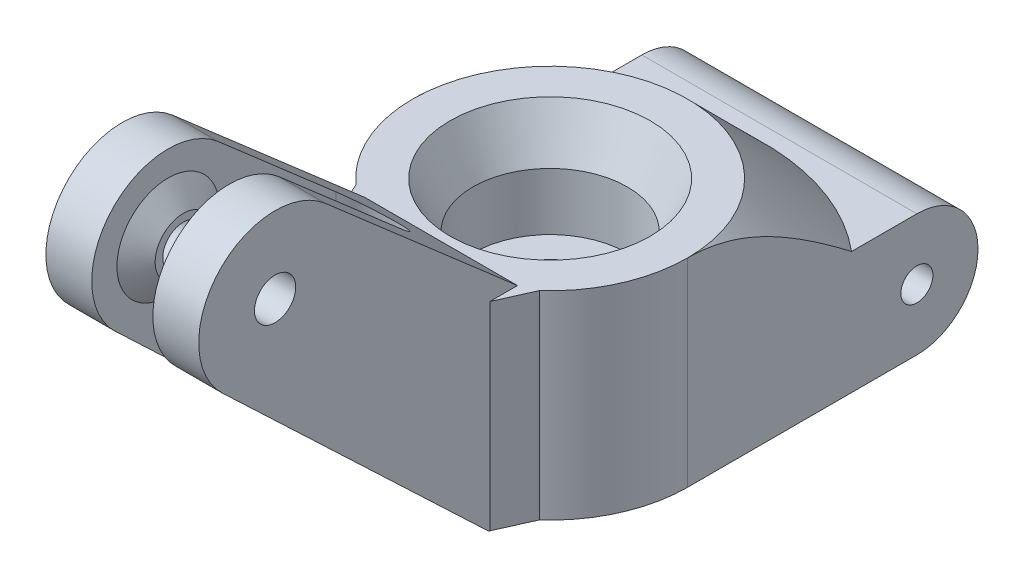
ISO-10303-21;
HEADER;
FILE_DESCRIPTION(('STEP AP214'),'2;1');
FILE_NAME('part.step','',(''),(''),'','','');
FILE_SCHEMA(('AUTOMOTIVE_DESIGN { 1 0 10303 214 1 1 1 1 }'));
ENDSEC;
DATA;
#1=APPLICATION_CONTEXT('core data for automotive mechanical design processes');
#2=APPLICATION_PROTOCOL_DEFINITION('international standard','automotive_design',2000,#1);
#3=PRODUCT_CONTEXT('',#1,'mechanical');
#4=PRODUCT('Part','Part','',(#3));
#5=PRODUCT_RELATED_PRODUCT_CATEGORY('part','',(#4));
#6=PRODUCT_DEFINITION_FORMATION('','',#4);
#7=PRODUCT_DEFINITION_CONTEXT('part definition',#1,'design');
#8=PRODUCT_DEFINITION('design','',#6,#7);
#9=PRODUCT_DEFINITION_SHAPE('','',#8);
#10=(LENGTH_UNIT() NAMED_UNIT(*) SI_UNIT(.MILLI.,.METRE.));
#11=(NAMED_UNIT(*) PLANE_ANGLE_UNIT() SI_UNIT($,.RADIAN.));
#12=(NAMED_UNIT(*) SI_UNIT($,.STERADIAN.) SOLID_ANGLE_UNIT());
#13=UNCERTAINTY_MEASURE_WITH_UNIT(LENGTH_MEASURE(1.E-05),#10,'distance_accuracy_value','');
#14=(GEOMETRIC_REPRESENTATION_CONTEXT(3) GLOBAL_UNCERTAINTY_ASSIGNED_CONTEXT((#13)) GLOBAL_UNIT_ASSIGNED_CONTEXT((#10,
#11,#12)) REPRESENTATION_CONTEXT('',''));
#15=CARTESIAN_POINT('',(0.,0.,0.));
#16=DIRECTION('',(0.,0.,1.));
#17=DIRECTION('',(1.,0.,0.));
#18=AXIS2_PLACEMENT_3D('',#15,#16,#17);
#19=CARTESIAN_POINT('',(1.,13.6784962974169,24.6));
#20=DIRECTION('',(1.,0.,0.));
#21=DIRECTION('',(0.,0.,-1.));
#22=AXIS2_PLACEMENT_3D('',#19,#20,#21);
#23=PLANE('',#22);
#24=CARTESIAN_POINT('',(1.,13.6784962974169,23.));
#25=DIRECTION('',(-1.,0.,0.));
#26=DIRECTION('',(0.,0.,1.));
#27=AXIS2_PLACEMENT_3D('',#24,#25,#26);
#28=CIRCLE('',#27,1.35);
#29=CARTESIAN_POINT('',(1.,13.6784962974169,24.35));
#30=VERTEX_POINT('',#29);
#31=EDGE_CURVE('E451',#30,#30,#28,.F.);
#32=ORIENTED_EDGE('',*,*,#31,.T.);
#33=EDGE_LOOP('',(#32));
#34=FACE_BOUND('',#33,.T.);
#35=CARTESIAN_POINT('',(0.999999999976353,13.6784962974169,23.));
#36=DIRECTION('',(1.,0.,0.));
#37=DIRECTION('',(0.,0.,-1.));
#38=AXIS2_PLACEMENT_3D('',#35,#36,#37);
#39=CIRCLE('',#38,1.85000000002265);
#40=CARTESIAN_POINT('',(0.999999999976353,13.6784962974169,21.1499999999774));
#41=VERTEX_POINT('',#40);
#42=EDGE_CURVE('E445',#41,#41,#39,.T.);
#43=ORIENTED_EDGE('',*,*,#42,.F.);
#44=EDGE_LOOP('',(#43));
#45=FACE_BOUND('',#44,.T.);
#46=ADVANCED_FACE('F34',(#34,#45),#23,.F.);
#47=CARTESIAN_POINT('',(-1.,13.6784962974169,24.6));
#48=DIRECTION('',(-1.,0.,0.));
#49=DIRECTION('',(0.,0.,1.));
#50=AXIS2_PLACEMENT_3D('',#47,#48,#49);
#51=PLANE('',#50);
#52=CARTESIAN_POINT('',(-1.00000000001425,13.6784962974169,23.));
#53=DIRECTION('',(-1.,0.,0.));
#54=DIRECTION('',(0.,0.,1.));
#55=AXIS2_PLACEMENT_3D('',#52,#53,#54);
#56=CIRCLE('',#55,1.85000000001492);
#57=CARTESIAN_POINT('',(-1.00000000001425,13.6784962974169,24.8500000000149));
#58=VERTEX_POINT('',#57);
#59=EDGE_CURVE('E448',#58,#58,#56,.T.);
#60=ORIENTED_EDGE('',*,*,#59,.F.);
#61=EDGE_LOOP('',(#60));
#62=FACE_BOUND('',#61,.T.);
#63=CARTESIAN_POINT('',(-1.,13.6784962974169,23.));
#64=DIRECTION('',(-1.,0.,0.));
#65=DIRECTION('',(0.,0.,1.));
#66=AXIS2_PLACEMENT_3D('',#63,#64,#65);
#67=CIRCLE('',#66,1.35);
#68=CARTESIAN_POINT('',(-1.,13.6784962974169,24.35));
#69=VERTEX_POINT('',#68);
#70=EDGE_CURVE('E205',#69,#69,#67,.T.);
#71=ORIENTED_EDGE('',*,*,#70,.T.);
#72=EDGE_LOOP('',(#71));
#73=FACE_BOUND('',#72,.T.);
#74=ADVANCED_FACE('F519',(#62,#73),#51,.F.);
#75=CARTESIAN_POINT('',(0.,6.5,0.));
#76=DIRECTION('',(0.,-1.,0.));
#77=DIRECTION('',(0.,0.,-1.));
#78=AXIS2_PLACEMENT_3D('',#75,#76,#77);
#79=CYLINDRICAL_SURFACE('',#78,5.05);
#80=CARTESIAN_POINT('',(0.,-0.25,0.));
#81=DIRECTION('',(0.,-1.,0.));
#82=DIRECTION('',(0.,0.,-1.));
#83=AXIS2_PLACEMENT_3D('',#80,#81,#82);
#84=CIRCLE('',#83,5.05);
#85=CARTESIAN_POINT('',(0.,-0.25,-5.05));
#86=VERTEX_POINT('',#85);
#87=EDGE_CURVE('E453',#86,#86,#84,.T.);
#88=ORIENTED_EDGE('',*,*,#87,.T.);
#89=EDGE_LOOP('',(#88));
#90=FACE_BOUND('',#89,.T.);
#91=CARTESIAN_POINT('',(0.,3.49999999997408,0.));
#92=DIRECTION('',(0.,1.,0.));
#93=DIRECTION('',(0.,0.,1.));
#94=AXIS2_PLACEMENT_3D('',#91,#92,#93);
#95=CIRCLE('',#94,5.0499999999829);
#96=CARTESIAN_POINT('',(0.,3.49999999997408,5.0499999999829));
#97=VERTEX_POINT('',#96);
#98=EDGE_CURVE('E183',#97,#97,#95,.T.);
#99=ORIENTED_EDGE('',*,*,#98,.T.);
#100=EDGE_LOOP('',(#99));
#101=FACE_BOUND('',#100,.T.);
#102=ADVANCED_FACE('F516',(#90,#101),#79,.F.);
#103=CARTESIAN_POINT('',(0.,-0.25,0.));
#104=DIRECTION('',(0.,-1.,0.));
#105=DIRECTION('',(0.,0.,-1.));
#106=AXIS2_PLACEMENT_3D('',#103,#104,#105);
#107=PLANE('',#106);
#108=CARTESIAN_POINT('',(0.,-0.25,0.));
#109=DIRECTION('',(0.,1.,0.));
#110=DIRECTION('',(0.,0.,1.));
#111=AXIS2_PLACEMENT_3D('',#108,#109,#110);
#112=CIRCLE('',#111,3.05);
#113=CARTESIAN_POINT('',(0.,-0.25,3.05));
#114=VERTEX_POINT('',#113);
#115=EDGE_CURVE('E458',#114,#114,#112,.T.);
#116=ORIENTED_EDGE('',*,*,#115,.F.);
#117=EDGE_LOOP('',(#116));
#118=FACE_BOUND('',#117,.T.);
#119=ORIENTED_EDGE('',*,*,#87,.F.);
#120=EDGE_LOOP('',(#119));
#121=FACE_BOUND('',#120,.T.);
#122=ADVANCED_FACE('F512',(#118,#121),#107,.F.);
#123=CARTESIAN_POINT('',(47.2923235334351,13.6784962974169,23.));
#124=DIRECTION('',(-1.,0.,0.));
#125=DIRECTION('',(0.,0.,1.));
#126=AXIS2_PLACEMENT_3D('',#123,#124,#125);
#127=CYLINDRICAL_SURFACE('',#126,1.35);
#128=ORIENTED_EDGE('',*,*,#31,.F.);
#129=EDGE_LOOP('',(#128));
#130=FACE_BOUND('',#129,.T.);
#131=CARTESIAN_POINT('',(5.,13.6784962974169,23.));
#132=DIRECTION('',(-1.,0.,0.));
#133=DIRECTION('',(0.,0.,1.));
#134=AXIS2_PLACEMENT_3D('',#131,#132,#133);
#135=CIRCLE('',#134,1.35);
#136=CARTESIAN_POINT('',(5.,13.6784962974169,24.35));
#137=VERTEX_POINT('',#136);
#138=EDGE_CURVE('E135',#137,#137,#135,.T.);
#139=ORIENTED_EDGE('',*,*,#138,.F.);
#140=EDGE_LOOP('',(#139));
#141=FACE_BOUND('',#140,.T.);
#142=ADVANCED_FACE('F505',(#130,#141),#127,.F.);
#143=CARTESIAN_POINT('',(-1.99999999989586,13.6784962974169,23.));
#144=DIRECTION('',(-1.,0.,0.));
#145=DIRECTION('',(0.,0.,1.));
#146=AXIS2_PLACEMENT_3D('',#143,#144,#145);
#147=CONICAL_SURFACE('',#146,3.34999999986576,0.982793723256074);
#148=CARTESIAN_POINT('',(-1.99999999997165,13.6784962974169,23.));
#149=DIRECTION('',(-1.,0.,0.));
#150=DIRECTION('',(0.,0.,1.));
#151=AXIS2_PLACEMENT_3D('',#148,#149,#150);
#152=CIRCLE('',#151,3.34999999997945);
#153=CARTESIAN_POINT('',(-1.99999999997165,13.6784962974169,26.3499999999794));
#154=VERTEX_POINT('',#153);
#155=EDGE_CURVE('E146',#154,#154,#152,.T.);
#156=ORIENTED_EDGE('',*,*,#155,.F.);
#157=EDGE_LOOP('',(#156));
#158=FACE_BOUND('',#157,.T.);
#159=ORIENTED_EDGE('',*,*,#59,.T.);
#160=EDGE_LOOP('',(#159));
#161=FACE_BOUND('',#160,.T.);
#162=ADVANCED_FACE('F495',(#158,#161),#147,.T.);
#163=CARTESIAN_POINT('',(1.99999999995271,13.6784962974169,23.));
#164=DIRECTION('',(1.,0.,0.));
#165=DIRECTION('',(0.,0.,-1.));
#166=AXIS2_PLACEMENT_3D('',#163,#164,#165);
#167=CONICAL_SURFACE('',#166,3.35000000004402,0.982793723264819);
#168=ORIENTED_EDGE('',*,*,#42,.T.);
#169=EDGE_LOOP('',(#168));
#170=FACE_BOUND('',#169,.T.);
#171=CARTESIAN_POINT('',(1.99999999995271,13.6784962974169,23.));
#172=DIRECTION('',(1.,0.,0.));
#173=DIRECTION('',(0.,0.,-1.));
#174=AXIS2_PLACEMENT_3D('',#171,#172,#173);
#175=CIRCLE('',#174,3.35000000004402);
#176=CARTESIAN_POINT('',(1.99999999995271,13.6784962974169,19.649999999956));
#177=VERTEX_POINT('',#176);
#178=EDGE_CURVE('E372',#177,#177,#175,.F.);
#179=ORIENTED_EDGE('',*,*,#178,.T.);
#180=EDGE_LOOP('',(#179));
#181=FACE_BOUND('',#180,.T.);
#182=ADVANCED_FACE('F492',(#170,#181),#167,.T.);
#183=CARTESIAN_POINT('',(47.2923235334351,13.6784962974169,23.));
#184=DIRECTION('',(-1.,0.,0.));
#185=DIRECTION('',(0.,0.,1.));
#186=AXIS2_PLACEMENT_3D('',#183,#184,#185);
#187=CYLINDRICAL_SURFACE('',#186,1.35);
#188=ORIENTED_EDGE('',*,*,#70,.F.);
#189=EDGE_LOOP('',(#188));
#190=FACE_BOUND('',#189,.T.);
#191=CARTESIAN_POINT('',(-5.,13.6784962974169,23.));
#192=DIRECTION('',(-1.,0.,0.));
#193=DIRECTION('',(0.,0.,1.));
#194=AXIS2_PLACEMENT_3D('',#191,#192,#193);
#195=CIRCLE('',#194,1.35);
#196=CARTESIAN_POINT('',(-5.,13.6784962974169,24.35));
#197=VERTEX_POINT('',#196);
#198=EDGE_CURVE('E366',#197,#197,#195,.T.);
#199=ORIENTED_EDGE('',*,*,#198,.T.);
#200=EDGE_LOOP('',(#199));
#201=FACE_BOUND('',#200,.T.);
#202=ADVANCED_FACE('F494',(#190,#201),#187,.F.);
#203=CARTESIAN_POINT('',(0.,6.49999999995998,0.));
#204=DIRECTION('',(0.,1.,0.));
#205=DIRECTION('',(0.,0.,1.));
#206=AXIS2_PLACEMENT_3D('',#203,#204,#205);
#207=CONICAL_SURFACE('',#206,6.54999999997585,0.463647609000806);
#208=CARTESIAN_POINT('',(0.,6.49999999995998,0.));
#209=DIRECTION('',(0.,1.,0.));
#210=DIRECTION('',(0.,0.,1.));
#211=AXIS2_PLACEMENT_3D('',#208,#209,#210);
#212=CIRCLE('',#211,6.54999999997585);
#213=CARTESIAN_POINT('',(0.,6.49999999995998,6.54999999997585));
#214=VERTEX_POINT('',#213);
#215=EDGE_CURVE('E355',#214,#214,#212,.T.);
#216=ORIENTED_EDGE('',*,*,#215,.T.);
#217=EDGE_LOOP('',(#216));
#218=FACE_BOUND('',#217,.T.);
#219=ORIENTED_EDGE('',*,*,#98,.F.);
#220=EDGE_LOOP('',(#219));
#221=FACE_BOUND('',#220,.T.);
#222=ADVANCED_FACE('F502',(#218,#221),#207,.F.);
#223=CARTESIAN_POINT('',(5.,11.9750607436954,13.4266058700264));
#224=DIRECTION('',(0.,-0.754325037994784,0.656501132561223));
#225=DIRECTION('',(0.,-0.656501132561223,-0.754325037994784));
#226=AXIS2_PLACEMENT_3D('',#223,#224,#225);
#227=PLANE('',#226);
#228=DIRECTION('',(0.,0.656501132561219,0.754325037994787));
#229=VECTOR('',#228,1.);
#230=CARTESIAN_POINT('',(-2.,10.7334628618586,12.));
#231=LINE('',#230,#229);
#232=CARTESIAN_POINT('',(-2.,10.7334628618586,12.));
#233=VERTEX_POINT('',#232);
#234=CARTESIAN_POINT('',(-2.,17.4501214873908,19.7174943371939));
#235=VERTEX_POINT('',#234);
#236=EDGE_CURVE('E128',#233,#235,#231,.T.);
#237=ORIENTED_EDGE('',*,*,#236,.F.);
#238=CARTESIAN_POINT('',(0.,10.7334628618586,12.));
#239=DIRECTION('',(0.,-0.754325037994784,0.656501132561223));
#240=DIRECTION('',(0.,0.656501132561223,0.754325037994784));
#241=AXIS2_PLACEMENT_3D('',#238,#239,#240);
#242=ELLIPSE('',#241,2.65137692541213,2.);
#243=CARTESIAN_POINT('',(2.,10.7334628618586,12.));
#244=VERTEX_POINT('',#243);
#245=EDGE_CURVE('E437',#233,#244,#242,.T.);
#246=ORIENTED_EDGE('',*,*,#245,.T.);
#247=DIRECTION('',(0.,0.656501132561219,0.754325037994787));
#248=VECTOR('',#247,1.);
#249=CARTESIAN_POINT('',(2.,10.7334628618586,12.));
#250=LINE('',#249,#248);
#251=CARTESIAN_POINT('',(2.,17.4501214873908,19.7174943371939));
#252=VERTEX_POINT('',#251);
#253=EDGE_CURVE('E211',#244,#252,#250,.T.);
#254=ORIENTED_EDGE('',*,*,#253,.T.);
#255=DIRECTION('',(-1.,0.,0.));
#256=VECTOR('',#255,1.);
#257=CARTESIAN_POINT('',(5.,17.4501214873908,19.7174943371939));
#258=LINE('',#257,#256);
#259=CARTESIAN_POINT('',(5.,17.4501214873908,19.7174943371939));
#260=VERTEX_POINT('',#259);
#261=EDGE_CURVE('E208',#260,#252,#258,.T.);
#262=ORIENTED_EDGE('',*,*,#261,.F.);
#263=DIRECTION('',(0.,0.656501132561222,0.754325037994784));
#264=VECTOR('',#263,1.);
#265=CARTESIAN_POINT('',(5.,6.5,7.13571740285894));
#266=LINE('',#265,#264);
#267=CARTESIAN_POINT('',(5.,6.5,7.13571740285894));
#268=VERTEX_POINT('',#267);
#269=EDGE_CURVE('E170',#268,#260,#266,.T.);
#270=ORIENTED_EDGE('',*,*,#269,.F.);
#271=DIRECTION('',(1.,0.,0.));
#272=VECTOR('',#271,1.);
#273=CARTESIAN_POINT('',(0.,6.5,7.13571740285894));
#274=LINE('',#273,#272);
#275=CARTESIAN_POINT('',(-5.,6.5,7.13571740285894));
#276=VERTEX_POINT('',#275);
#277=EDGE_CURVE('E195',#268,#276,#274,.F.);
#278=ORIENTED_EDGE('',*,*,#277,.T.);
#279=DIRECTION('',(0.,0.656501132561222,0.754325037994784));
#280=VECTOR('',#279,1.);
#281=CARTESIAN_POINT('',(-5.,6.5,7.13571740285894));
#282=LINE('',#281,#280);
#283=CARTESIAN_POINT('',(-5.,17.4501214873908,19.7174943371939));
#284=VERTEX_POINT('',#283);
#285=EDGE_CURVE('E132',#276,#284,#282,.T.);
#286=ORIENTED_EDGE('',*,*,#285,.T.);
#287=DIRECTION('',(-1.,0.,0.));
#288=VECTOR('',#287,1.);
#289=CARTESIAN_POINT('',(5.,17.4501214873908,19.7174943371939));
#290=LINE('',#289,#288);
#291=EDGE_CURVE('E124',#235,#284,#290,.T.);
#292=ORIENTED_EDGE('',*,*,#291,.F.);
#293=EDGE_LOOP('',(#237,#246,#254,#262,#270,#278,#286,#292));
#294=FACE_BOUND('',#293,.T.);
#295=ADVANCED_FACE('F126',(#294),#227,.F.);
#296=CARTESIAN_POINT('',(5.,13.6784962974169,23.));
#297=DIRECTION('',(1.,0.,0.));
#298=DIRECTION('',(0.,0.,-1.));
#299=AXIS2_PLACEMENT_3D('',#296,#297,#298);
#300=PLANE('',#299);
#301=ORIENTED_EDGE('',*,*,#138,.T.);
#302=EDGE_LOOP('',(#301));
#303=FACE_BOUND('',#302,.T.);
#304=CARTESIAN_POINT('',(5.,13.6784962974169,23.));
#305=DIRECTION('',(-1.,0.,0.));
#306=DIRECTION('',(0.,0.,1.));
#307=AXIS2_PLACEMENT_3D('',#304,#305,#306);
#308=CIRCLE('',#307,5.);
#309=CARTESIAN_POINT('',(5.,10.0516244423554,26.4417728784688));
#310=VERTEX_POINT('',#309);
#311=EDGE_CURVE('E360',#310,#260,#308,.T.);
#312=ORIENTED_EDGE('',*,*,#311,.F.);
#313=DIRECTION('',(0.,0.688354575693754,0.725374371012288));
#314=VECTOR('',#313,1.);
#315=CARTESIAN_POINT('',(5.,1.77581222117773,17.7208864392344));
#316=LINE('',#315,#314);
#317=CARTESIAN_POINT('',(5.,-6.5,9.));
#318=VERTEX_POINT('',#317);
#319=EDGE_CURVE('E160',#310,#318,#316,.F.);
#320=ORIENTED_EDGE('',*,*,#319,.T.);
#321=DIRECTION('',(0.,0.,-1.));
#322=VECTOR('',#321,1.);
#323=CARTESIAN_POINT('',(5.,-6.5,23.));
#324=LINE('',#323,#322);
#325=CARTESIAN_POINT('',(5.,-6.5,8.94427190999927));
#326=VERTEX_POINT('',#325);
#327=EDGE_CURVE('E173',#318,#326,#324,.T.);
#328=ORIENTED_EDGE('',*,*,#327,.T.);
#329=DIRECTION('',(0.,1.,0.));
#330=VECTOR('',#329,1.);
#331=CARTESIAN_POINT('',(5.,6.5,8.94427190999927));
#332=LINE('',#331,#330);
#333=CARTESIAN_POINT('',(5.,6.5,8.94427190999927));
#334=VERTEX_POINT('',#333);
#335=EDGE_CURVE('E178',#334,#326,#332,.F.);
#336=ORIENTED_EDGE('',*,*,#335,.F.);
#337=DIRECTION('',(0.,0.,-1.));
#338=VECTOR('',#337,1.);
#339=CARTESIAN_POINT('',(5.,6.5,0.));
#340=LINE('',#339,#338);
#341=EDGE_CURVE('E192',#334,#268,#340,.T.);
#342=ORIENTED_EDGE('',*,*,#341,.T.);
#343=ORIENTED_EDGE('',*,*,#269,.T.);
#344=EDGE_LOOP('',(#312,#320,#328,#336,#342,#343));
#345=FACE_BOUND('',#344,.T.);
#346=ADVANCED_FACE('F386',(#303,#345),#300,.T.);
#347=CARTESIAN_POINT('',(5.,13.6784962974169,23.));
#348=DIRECTION('',(-1.,0.,0.));
#349=DIRECTION('',(0.,0.,1.));
#350=AXIS2_PLACEMENT_3D('',#347,#348,#349);
#351=CYLINDRICAL_SURFACE('',#350,5.);
#352=CARTESIAN_POINT('',(-5.,13.6784962974169,23.));
#353=DIRECTION('',(-1.,0.,0.));
#354=DIRECTION('',(0.,0.,1.));
#355=AXIS2_PLACEMENT_3D('',#352,#353,#354);
#356=CIRCLE('',#355,5.);
#357=CARTESIAN_POINT('',(-5.,10.0516244423554,26.4417728784688));
#358=VERTEX_POINT('',#357);
#359=EDGE_CURVE('E359',#284,#358,#356,.F.);
#360=ORIENTED_EDGE('',*,*,#359,.T.);
#361=DIRECTION('',(1.,0.,0.));
#362=VECTOR('',#361,1.);
#363=CARTESIAN_POINT('',(5.,10.0516244423554,26.4417728784688));
#364=LINE('',#363,#362);
#365=CARTESIAN_POINT('',(-2.,10.0516244423554,26.4417728784688));
#366=VERTEX_POINT('',#365);
#367=EDGE_CURVE('E142',#358,#366,#364,.T.);
#368=ORIENTED_EDGE('',*,*,#367,.T.);
#369=CARTESIAN_POINT('',(-2.,13.6784962974169,23.));
#370=DIRECTION('',(-1.,0.,0.));
#371=DIRECTION('',(0.,0.,1.));
#372=AXIS2_PLACEMENT_3D('',#369,#370,#371);
#373=CIRCLE('',#372,5.);
#374=EDGE_CURVE('E139',#235,#366,#373,.F.);
#375=ORIENTED_EDGE('',*,*,#374,.F.);
#376=ORIENTED_EDGE('',*,*,#291,.T.);
#377=EDGE_LOOP('',(#360,#368,#375,#376));
#378=FACE_BOUND('',#377,.T.);
#379=ADVANCED_FACE('F140',(#378),#351,.T.);
#380=CARTESIAN_POINT('',(-2.,0.,0.));
#381=DIRECTION('',(1.,0.,0.));
#382=DIRECTION('',(0.,0.,-1.));
#383=AXIS2_PLACEMENT_3D('',#380,#381,#382);
#384=PLANE('',#383);
#385=ORIENTED_EDGE('',*,*,#155,.T.);
#386=EDGE_LOOP('',(#385));
#387=FACE_BOUND('',#386,.T.);
#388=ORIENTED_EDGE('',*,*,#236,.T.);
#389=ORIENTED_EDGE('',*,*,#374,.T.);
#390=DIRECTION('',(0.,0.688354575693754,0.725374371012288));
#391=VECTOR('',#390,1.);
#392=CARTESIAN_POINT('',(-2.,1.77581222117773,17.7208864392344));
#393=LINE('',#392,#391);
#394=CARTESIAN_POINT('',(-2.,-3.65310629985537,12.));
#395=VERTEX_POINT('',#394);
#396=EDGE_CURVE('E156',#366,#395,#393,.F.);
#397=ORIENTED_EDGE('',*,*,#396,.T.);
#398=DIRECTION('',(0.,-1.,0.));
#399=VECTOR('',#398,1.);
#400=CARTESIAN_POINT('',(-2.,0.,12.));
#401=LINE('',#400,#399);
#402=EDGE_CURVE('E150',#395,#233,#401,.F.);
#403=ORIENTED_EDGE('',*,*,#402,.T.);
#404=EDGE_LOOP('',(#388,#389,#397,#403));
#405=FACE_BOUND('',#404,.T.);
#406=ADVANCED_FACE('F148',(#387,#405),#384,.T.);
#407=CARTESIAN_POINT('',(0.,4.99387508232712,12.));
#408=DIRECTION('',(0.,1.,0.));
#409=DIRECTION('',(0.,0.,1.));
#410=AXIS2_PLACEMENT_3D('',#407,#408,#409);
#411=CYLINDRICAL_SURFACE('',#410,2.);
#412=DIRECTION('',(0.,1.,0.));
#413=VECTOR('',#412,1.);
#414=CARTESIAN_POINT('',(2.,0.,12.));
#415=LINE('',#414,#413);
#416=CARTESIAN_POINT('',(2.,-3.65310629985537,12.));
#417=VERTEX_POINT('',#416);
#418=EDGE_CURVE('E370',#417,#244,#415,.T.);
#419=ORIENTED_EDGE('',*,*,#418,.T.);
#420=ORIENTED_EDGE('',*,*,#245,.F.);
#421=ORIENTED_EDGE('',*,*,#402,.F.);
#422=CARTESIAN_POINT('',(0.,-3.65310629985537,12.));
#423=DIRECTION('',(0.,0.725374371012288,-0.688354575693754));
#424=DIRECTION('',(0.,0.688354575693754,0.725374371012288));
#425=AXIS2_PLACEMENT_3D('',#422,#423,#424);
#426=ELLIPSE('',#425,2.75719694536343,2.);
#427=EDGE_CURVE('E339',#395,#417,#426,.F.);
#428=ORIENTED_EDGE('',*,*,#427,.T.);
#429=EDGE_LOOP('',(#419,#420,#421,#428));
#430=FACE_BOUND('',#429,.T.);
#431=ADVANCED_FACE('F482',(#430),#411,.F.);
#432=CARTESIAN_POINT('',(2.,0.,0.));
#433=DIRECTION('',(1.,0.,0.));
#434=DIRECTION('',(0.,0.,-1.));
#435=AXIS2_PLACEMENT_3D('',#432,#433,#434);
#436=PLANE('',#435);
#437=ORIENTED_EDGE('',*,*,#418,.F.);
#438=DIRECTION('',(0.,0.688354575693754,0.725374371012288));
#439=VECTOR('',#438,1.);
#440=CARTESIAN_POINT('',(2.,1.77581222117773,17.7208864392344));
#441=LINE('',#440,#439);
#442=CARTESIAN_POINT('',(2.,10.0516244423554,26.4417728784688));
#443=VERTEX_POINT('',#442);
#444=EDGE_CURVE('E337',#417,#443,#441,.T.);
#445=ORIENTED_EDGE('',*,*,#444,.T.);
#446=CARTESIAN_POINT('',(2.,13.6784962974169,23.));
#447=DIRECTION('',(-1.,0.,0.));
#448=DIRECTION('',(0.,0.,1.));
#449=AXIS2_PLACEMENT_3D('',#446,#447,#448);
#450=CIRCLE('',#449,5.);
#451=EDGE_CURVE('E210',#252,#443,#450,.F.);
#452=ORIENTED_EDGE('',*,*,#451,.F.);
#453=ORIENTED_EDGE('',*,*,#253,.F.);
#454=EDGE_LOOP('',(#437,#445,#452,#453));
#455=FACE_BOUND('',#454,.T.);
#456=ORIENTED_EDGE('',*,*,#178,.F.);
#457=EDGE_LOOP('',(#456));
#458=FACE_BOUND('',#457,.T.);
#459=ADVANCED_FACE('F486',(#455,#458),#436,.F.);
#460=CARTESIAN_POINT('',(5.,13.6784962974169,23.));
#461=DIRECTION('',(-1.,0.,0.));
#462=DIRECTION('',(0.,0.,1.));
#463=AXIS2_PLACEMENT_3D('',#460,#461,#462);
#464=CYLINDRICAL_SURFACE('',#463,5.);
#465=DIRECTION('',(1.,0.,0.));
#466=VECTOR('',#465,1.);
#467=CARTESIAN_POINT('',(5.,10.0516244423554,26.4417728784688));
#468=LINE('',#467,#466);
#469=EDGE_CURVE('E334',#443,#310,#468,.T.);
#470=ORIENTED_EDGE('',*,*,#469,.T.);
#471=ORIENTED_EDGE('',*,*,#311,.T.);
#472=ORIENTED_EDGE('',*,*,#261,.T.);
#473=ORIENTED_EDGE('',*,*,#451,.T.);
#474=EDGE_LOOP('',(#470,#471,#472,#473));
#475=FACE_BOUND('',#474,.T.);
#476=ADVANCED_FACE('F379',(#475),#464,.T.);
#477=CARTESIAN_POINT('',(-5.,13.6784962974169,23.));
#478=DIRECTION('',(1.,0.,0.));
#479=DIRECTION('',(0.,0.,-1.));
#480=AXIS2_PLACEMENT_3D('',#477,#478,#479);
#481=PLANE('',#480);
#482=ORIENTED_EDGE('',*,*,#198,.F.);
#483=EDGE_LOOP('',(#482));
#484=FACE_BOUND('',#483,.T.);
#485=DIRECTION('',(0.,1.,0.));
#486=VECTOR('',#485,1.);
#487=CARTESIAN_POINT('',(-4.99999999999999,6.5,8.94427190999926));
#488=LINE('',#487,#486);
#489=CARTESIAN_POINT('',(-5.,-6.5,8.94427190999927));
#490=VERTEX_POINT('',#489);
#491=CARTESIAN_POINT('',(-4.99999999999999,6.5,8.94427190999926));
#492=VERTEX_POINT('',#491);
#493=EDGE_CURVE('E331',#490,#492,#488,.T.);
#494=ORIENTED_EDGE('',*,*,#493,.F.);
#495=DIRECTION('',(0.,0.,-1.));
#496=VECTOR('',#495,1.);
#497=CARTESIAN_POINT('',(-5.,-6.5,23.));
#498=LINE('',#497,#496);
#499=CARTESIAN_POINT('',(-5.,-6.5,9.));
#500=VERTEX_POINT('',#499);
#501=EDGE_CURVE('E363',#500,#490,#498,.T.);
#502=ORIENTED_EDGE('',*,*,#501,.F.);
#503=DIRECTION('',(0.,0.688354575693754,0.725374371012288));
#504=VECTOR('',#503,1.);
#505=CARTESIAN_POINT('',(-5.,1.77581222117773,17.7208864392344));
#506=LINE('',#505,#504);
#507=EDGE_CURVE('E157',#500,#358,#506,.T.);
#508=ORIENTED_EDGE('',*,*,#507,.T.);
#509=ORIENTED_EDGE('',*,*,#359,.F.);
#510=ORIENTED_EDGE('',*,*,#285,.F.);
#511=DIRECTION('',(0.,0.,-1.));
#512=VECTOR('',#511,1.);
#513=CARTESIAN_POINT('',(-5.,6.5,0.));
#514=LINE('',#513,#512);
#515=EDGE_CURVE('E196',#276,#492,#514,.F.);
#516=ORIENTED_EDGE('',*,*,#515,.T.);
#517=EDGE_LOOP('',(#494,#502,#508,#509,#510,#516));
#518=FACE_BOUND('',#517,.T.);
#519=ADVANCED_FACE('F480',(#484,#518),#481,.F.);
#520=CARTESIAN_POINT('',(0.,6.5,0.));
#521=DIRECTION('',(0.,-1.,0.));
#522=DIRECTION('',(0.,0.,-1.));
#523=AXIS2_PLACEMENT_3D('',#520,#521,#522);
#524=PLANE('',#523);
#525=ORIENTED_EDGE('',*,*,#341,.F.);
#526=DIRECTION('',(0.408248290463849,0.,-0.912870929175283));
#527=VECTOR('',#526,1.);
#528=CARTESIAN_POINT('',(5.,6.5,8.94427190999927));
#529=LINE('',#528,#527);
#530=CARTESIAN_POINT('',(6.00000000000001,6.5,6.70820393249936));
#531=VERTEX_POINT('',#530);
#532=EDGE_CURVE('E186',#531,#334,#529,.F.);
#533=ORIENTED_EDGE('',*,*,#532,.F.);
#534=CARTESIAN_POINT('',(0.,6.5,0.));
#535=DIRECTION('',(0.,-1.,0.));
#536=DIRECTION('',(0.,0.,-1.));
#537=AXIS2_PLACEMENT_3D('',#534,#535,#536);
#538=CIRCLE('',#537,9.);
#539=CARTESIAN_POINT('',(9.,6.5,0.));
#540=VERTEX_POINT('',#539);
#541=EDGE_CURVE('E343',#540,#531,#538,.T.);
#542=ORIENTED_EDGE('',*,*,#541,.F.);
#543=CARTESIAN_POINT('',(0.,6.5,0.));
#544=DIRECTION('',(0.,-1.,0.));
#545=DIRECTION('',(0.,0.,-1.));
#546=AXIS2_PLACEMENT_3D('',#543,#544,#545);
#547=CIRCLE('',#546,9.);
#548=CARTESIAN_POINT('',(-9.,6.5,0.));
#549=VERTEX_POINT('',#548);
#550=EDGE_CURVE('E418',#549,#540,#547,.T.);
#551=ORIENTED_EDGE('',*,*,#550,.F.);
#552=CARTESIAN_POINT('',(0.,6.5,0.));
#553=DIRECTION('',(0.,-1.,0.));
#554=DIRECTION('',(0.,0.,-1.));
#555=AXIS2_PLACEMENT_3D('',#552,#553,#554);
#556=CIRCLE('',#555,9.);
#557=CARTESIAN_POINT('',(-6.,6.5,6.70820393249937));
#558=VERTEX_POINT('',#557);
#559=EDGE_CURVE('E329',#558,#549,#556,.T.);
#560=ORIENTED_EDGE('',*,*,#559,.F.);
#561=DIRECTION('',(0.408248290463849,0.,0.912870929175283));
#562=VECTOR('',#561,1.);
#563=CARTESIAN_POINT('',(-6.,6.5,6.70820393249936));
#564=LINE('',#563,#562);
#565=EDGE_CURVE('E330',#492,#558,#564,.F.);
#566=ORIENTED_EDGE('',*,*,#565,.F.);
#567=ORIENTED_EDGE('',*,*,#515,.F.);
#568=ORIENTED_EDGE('',*,*,#277,.F.);
#569=EDGE_LOOP('',(#525,#533,#542,#551,#560,#566,#567,#568));
#570=FACE_BOUND('',#569,.T.);
#571=ORIENTED_EDGE('',*,*,#215,.F.);
#572=EDGE_LOOP('',(#571));
#573=FACE_BOUND('',#572,.T.);
#574=ADVANCED_FACE('F476',(#570,#573),#524,.F.);
#575=CARTESIAN_POINT('',(-500000.,-2.5,-15.));
#576=DIRECTION('',(1.,0.,0.));
#577=DIRECTION('',(0.,0.,-1.));
#578=AXIS2_PLACEMENT_3D('',#575,#576,#577);
#579=CYLINDRICAL_SURFACE('',#578,1.05);
#580=CARTESIAN_POINT('',(9.00000000001455,-2.5,-15.));
#581=DIRECTION('',(1.,0.,0.));
#582=DIRECTION('',(0.,0.,-1.));
#583=AXIS2_PLACEMENT_3D('',#580,#581,#582);
#584=CIRCLE('',#583,1.05);
#585=CARTESIAN_POINT('',(9.00000000001455,-2.5,-16.05));
#586=VERTEX_POINT('',#585);
#587=EDGE_CURVE('E235',#586,#586,#584,.F.);
#588=ORIENTED_EDGE('',*,*,#587,.F.);
#589=EDGE_LOOP('',(#588));
#590=FACE_BOUND('',#589,.T.);
#591=CARTESIAN_POINT('',(-9.00000000001455,-2.5,-15.));
#592=DIRECTION('',(1.,0.,0.));
#593=DIRECTION('',(0.,0.,-1.));
#594=AXIS2_PLACEMENT_3D('',#591,#592,#593);
#595=CIRCLE('',#594,1.05);
#596=CARTESIAN_POINT('',(-9.00000000001455,-2.5,-16.05));
#597=VERTEX_POINT('',#596);
#598=EDGE_CURVE('E262',#597,#597,#595,.F.);
#599=ORIENTED_EDGE('',*,*,#598,.T.);
#600=EDGE_LOOP('',(#599));
#601=FACE_BOUND('',#600,.T.);
#602=ADVANCED_FACE('F538',(#590,#601),#579,.F.);
#603=CARTESIAN_POINT('',(9.,1.5,-7.5));
#604=DIRECTION('',(0.,-1.,0.));
#605=DIRECTION('',(0.,0.,-1.));
#606=AXIS2_PLACEMENT_3D('',#603,#604,#605);
#607=PLANE('',#606);
#608=CARTESIAN_POINT('',(0.,1.5,0.));
#609=DIRECTION('',(0.,-1.,0.));
#610=DIRECTION('',(0.,0.,-1.));
#611=AXIS2_PLACEMENT_3D('',#608,#609,#610);
#612=CIRCLE('',#611,14.);
#613=CARTESIAN_POINT('',(9.,1.5,-10.7238052947636));
#614=VERTEX_POINT('',#613);
#615=CARTESIAN_POINT('',(-9.,1.5,-10.7238052947636));
#616=VERTEX_POINT('',#615);
#617=EDGE_CURVE('E200',#614,#616,#612,.F.);
#618=ORIENTED_EDGE('',*,*,#617,.F.);
#619=DIRECTION('',(0.,0.,-1.));
#620=VECTOR('',#619,1.);
#621=CARTESIAN_POINT('',(9.,1.5,-15.));
#622=LINE('',#621,#620);
#623=CARTESIAN_POINT('',(9.,1.5,-15.));
#624=VERTEX_POINT('',#623);
#625=EDGE_CURVE('E234',#624,#614,#622,.F.);
#626=ORIENTED_EDGE('',*,*,#625,.F.);
#627=DIRECTION('',(-1.,0.,0.));
#628=VECTOR('',#627,1.);
#629=CARTESIAN_POINT('',(9.,1.5,-15.));
#630=LINE('',#629,#628);
#631=CARTESIAN_POINT('',(-9.,1.5,-15.));
#632=VERTEX_POINT('',#631);
#633=EDGE_CURVE('E348',#632,#624,#630,.F.);
#634=ORIENTED_EDGE('',*,*,#633,.F.);
#635=DIRECTION('',(0.,0.,-1.));
#636=VECTOR('',#635,1.);
#637=CARTESIAN_POINT('',(-9.,1.5,-15.));
#638=LINE('',#637,#636);
#639=EDGE_CURVE('E321',#632,#616,#638,.F.);
#640=ORIENTED_EDGE('',*,*,#639,.T.);
#641=EDGE_LOOP('',(#618,#626,#634,#640));
#642=FACE_BOUND('',#641,.T.);
#643=ADVANCED_FACE('F247',(#642),#607,.F.);
#644=CARTESIAN_POINT('',(0.,1.5,0.));
#645=DIRECTION('',(0.,-1.,0.));
#646=DIRECTION('',(0.,0.,-1.));
#647=AXIS2_PLACEMENT_3D('',#644,#645,#646);
#648=CONICAL_SURFACE('',#647,14.,0.785398163397448);
#649=CARTESIAN_POINT('',(-9.,1.5,-10.7238052947636));
#650=CARTESIAN_POINT('',(-9.,1.71316971976153,-10.4454319030313));
#651=CARTESIAN_POINT('',(-9.,1.92426520978799,-10.1654392557351));
#652=CARTESIAN_POINT('',(-9.,2.34127756010684,-9.60148270552378));
#653=CARTESIAN_POINT('',(-9.,2.54719265272238,-9.31751749715698));
#654=CARTESIAN_POINT('',(-9.,2.95441077203168,-8.74261066759795));
#655=CARTESIAN_POINT('',(-9.,3.15565897683418,-8.45163006965748));
#656=CARTESIAN_POINT('',(-9.,3.5501157266273,-7.86429413869675));
#657=CARTESIAN_POINT('',(-9.,3.74332514641737,-7.5679393955698));
#658=CARTESIAN_POINT('',(-9.,4.11135109358233,-6.98218497770914));
#659=CARTESIAN_POINT('',(-9.,4.28660335226297,-6.69306028605395));
#660=CARTESIAN_POINT('',(-9.,4.6256453886614,-6.10806293387794));
#661=CARTESIAN_POINT('',(-9.,4.7894333543612,-5.81218921637752));
#662=CARTESIAN_POINT('',(-9.,5.10202209347351,-5.21371907613065));
#663=CARTESIAN_POINT('',(-9.,5.2508670613525,-4.9111459143701));
#664=CARTESIAN_POINT('',(-9.,5.53024835185193,-4.29772448259318));
#665=CARTESIAN_POINT('',(-9.,5.66079292303338,-3.98688001637156));
#666=CARTESIAN_POINT('',(-9.,5.88955998343776,-3.38124758885551));
#667=CARTESIAN_POINT('',(-9.,5.9895174629741,-3.0871206829836));
#668=CARTESIAN_POINT('',(-9.,6.16571970157694,-2.49186547436849));
#669=CARTESIAN_POINT('',(-9.,6.24197794747373,-2.19074125893336));
#670=CARTESIAN_POINT('',(-9.,6.33612678260047,-1.73193647056293));
#671=CARTESIAN_POINT('',(-9.,6.3643016061968,-1.5763268751873));
#672=CARTESIAN_POINT('',(-9.,6.41299448881295,-1.26390860989743));
#673=CARTESIAN_POINT('',(-9.,6.4335129891943,-1.1071000096338));
#674=CARTESIAN_POINT('',(-9.,6.46656537374254,-0.792153340710454));
#675=CARTESIAN_POINT('',(-9.,6.4790745376764,-0.634012667852245));
#676=CARTESIAN_POINT('',(-9.,6.49580678074533,-0.31725152237369));
#677=CARTESIAN_POINT('',(-9.,6.50002757966074,-0.158630929739364));
#678=CARTESIAN_POINT('',(-9.,6.5,0.));
#679=B_SPLINE_CURVE_WITH_KNOTS('',3,(#649,#650,#651,#652,#653,#654,#655,#656,#657,#658,#659,
#660,#661,#662,#663,#664,#665,#666,#667,#668,#669,#670,#671,#672,#673,#674,#675,#676,#677,#678),
.UNSPECIFIED.,.F.,.F.,(4,2,2,2,2,2,2,2,2,2,2,2,2,2,4),(0.,1.05188117302124,2.10411653439653,
3.1653919094779,4.22655149039431,5.24061936841527,6.25484716726072,7.26598105162238,
8.27665771080171,9.20781170423384,10.1384348193141,10.6126942858757,11.0869264087339,
11.5626152472645,12.0384349346605),.UNSPECIFIED.);
#680=EDGE_CURVE('E253',#616,#549,#679,.T.);
#681=ORIENTED_EDGE('',*,*,#680,.T.);
#682=ORIENTED_EDGE('',*,*,#550,.T.);
#683=CARTESIAN_POINT('',(9.,1.5,-10.7238052947636));
#684=CARTESIAN_POINT('',(9.,1.71316971976153,-10.4454319030313));
#685=CARTESIAN_POINT('',(9.,1.92426520978799,-10.1654392557351));
#686=CARTESIAN_POINT('',(9.,2.34127756010684,-9.60148270552378));
#687=CARTESIAN_POINT('',(9.,2.54719265272238,-9.31751749715698));
#688=CARTESIAN_POINT('',(9.,2.95441077203168,-8.74261066759795));
#689=CARTESIAN_POINT('',(9.,3.15565897683418,-8.45163006965748));
#690=CARTESIAN_POINT('',(9.,3.5501157266273,-7.86429413869675));
#691=CARTESIAN_POINT('',(9.,3.74332514641737,-7.5679393955698));
#692=CARTESIAN_POINT('',(9.,4.11135109358233,-6.98218497770914));
#693=CARTESIAN_POINT('',(9.,4.28660335226297,-6.69306028605395));
#694=CARTESIAN_POINT('',(9.,4.6256453886614,-6.10806293387794));
#695=CARTESIAN_POINT('',(9.,4.7894333543612,-5.81218921637752));
#696=CARTESIAN_POINT('',(9.,5.10202209347351,-5.21371907613065));
#697=CARTESIAN_POINT('',(9.,5.2508670613525,-4.9111459143701));
#698=CARTESIAN_POINT('',(9.,5.53024835185193,-4.29772448259318));
#699=CARTESIAN_POINT('',(9.,5.66079292303338,-3.98688001637156));
#700=CARTESIAN_POINT('',(9.,5.88955998343776,-3.38124758885551));
#701=CARTESIAN_POINT('',(9.,5.9895174629741,-3.0871206829836));
#702=CARTESIAN_POINT('',(9.,6.16571970157694,-2.49186547436849));
#703=CARTESIAN_POINT('',(9.,6.24197794747373,-2.19074125893336));
#704=CARTESIAN_POINT('',(9.,6.33612678260047,-1.73193647056293));
#705=CARTESIAN_POINT('',(9.,6.3643016061968,-1.5763268751873));
#706=CARTESIAN_POINT('',(9.,6.41299448881295,-1.26390860989743));
#707=CARTESIAN_POINT('',(9.,6.4335129891943,-1.1071000096338));
#708=CARTESIAN_POINT('',(9.,6.46656537374254,-0.792153340710456));
#709=CARTESIAN_POINT('',(9.,6.4790745376764,-0.634012667852247));
#710=CARTESIAN_POINT('',(9.,6.49580678074532,-0.317251522373693));
#711=CARTESIAN_POINT('',(9.,6.50002757966074,-0.158630929739366));
#712=CARTESIAN_POINT('',(9.,6.5,0.));
#713=B_SPLINE_CURVE_WITH_KNOTS('',3,(#683,#684,#685,#686,#687,#688,#689,#690,#691,#692,#693,
#694,#695,#696,#697,#698,#699,#700,#701,#702,#703,#704,#705,#706,#707,#708,#709,#710,#711,#712),
.UNSPECIFIED.,.F.,.F.,(4,2,2,2,2,2,2,2,2,2,2,2,2,2,4),(0.,1.05188117302124,2.10411653439653,
3.1653919094779,4.22655149039431,5.24061936841527,6.25484716726073,7.26598105162238,
8.27665771080171,9.20781170423384,10.1384348193141,10.6126942858757,11.0869264087339,
11.5626152472645,12.0384349346605),.UNSPECIFIED.);
#714=EDGE_CURVE('E225',#614,#540,#713,.T.);
#715=ORIENTED_EDGE('',*,*,#714,.F.);
#716=ORIENTED_EDGE('',*,*,#617,.T.);
#717=EDGE_LOOP('',(#681,#682,#715,#716));
#718=FACE_BOUND('',#717,.T.);
#719=ADVANCED_FACE('F241',(#718),#648,.T.);
#720=CARTESIAN_POINT('',(0.,-2.6,0.));
#721=DIRECTION('',(0.,-1.,0.));
#722=DIRECTION('',(0.,0.,-1.));
#723=AXIS2_PLACEMENT_3D('',#720,#721,#722);
#724=PLANE('',#723);
#725=CARTESIAN_POINT('',(0.,-2.6,0.));
#726=DIRECTION('',(0.,-1.,0.));
#727=DIRECTION('',(0.,0.,-1.));
#728=AXIS2_PLACEMENT_3D('',#725,#726,#727);
#729=CIRCLE('',#728,3.05);
#730=CARTESIAN_POINT('',(0.,-2.6,3.05));
#731=VERTEX_POINT('',#730);
#732=EDGE_CURVE('E37',#731,#731,#729,.T.);
#733=ORIENTED_EDGE('',*,*,#732,.F.);
#734=EDGE_LOOP('',(#733));
#735=FACE_BOUND('',#734,.T.);
#736=CARTESIAN_POINT('',(0.,-2.6,0.));
#737=DIRECTION('',(0.,-1.,0.));
#738=DIRECTION('',(0.,0.,-1.));
#739=AXIS2_PLACEMENT_3D('',#736,#737,#738);
#740=CIRCLE('',#739,5.05);
#741=CARTESIAN_POINT('',(0.,-2.6,-5.05));
#742=VERTEX_POINT('',#741);
#743=EDGE_CURVE('E220',#742,#742,#740,.T.);
#744=ORIENTED_EDGE('',*,*,#743,.T.);
#745=EDGE_LOOP('',(#744));
#746=FACE_BOUND('',#745,.T.);
#747=ADVANCED_FACE('F246',(#735,#746),#724,.T.);
#748=CARTESIAN_POINT('',(0.,6.5,0.));
#749=DIRECTION('',(0.,-1.,0.));
#750=DIRECTION('',(0.,0.,-1.));
#751=AXIS2_PLACEMENT_3D('',#748,#749,#750);
#752=CYLINDRICAL_SURFACE('',#751,9.);
#753=CARTESIAN_POINT('',(0.,-6.5,0.));
#754=DIRECTION('',(0.,-1.,0.));
#755=DIRECTION('',(0.,0.,-1.));
#756=AXIS2_PLACEMENT_3D('',#753,#754,#755);
#757=CIRCLE('',#756,9.);
#758=CARTESIAN_POINT('',(9.,-6.5,0.));
#759=VERTEX_POINT('',#758);
#760=CARTESIAN_POINT('',(6.,-6.5,6.70820393249937));
#761=VERTEX_POINT('',#760);
#762=EDGE_CURVE('E217',#759,#761,#757,.T.);
#763=ORIENTED_EDGE('',*,*,#762,.F.);
#764=DIRECTION('',(0.,1.,0.));
#765=VECTOR('',#764,1.);
#766=CARTESIAN_POINT('',(9.,-2.5,0.));
#767=LINE('',#766,#765);
#768=EDGE_CURVE('E224',#540,#759,#767,.F.);
#769=ORIENTED_EDGE('',*,*,#768,.F.);
#770=ORIENTED_EDGE('',*,*,#541,.T.);
#771=DIRECTION('',(0.,1.,0.));
#772=VECTOR('',#771,1.);
#773=CARTESIAN_POINT('',(6.00000000000001,6.5,6.70820393249936));
#774=LINE('',#773,#772);
#775=EDGE_CURVE('E189',#761,#531,#774,.T.);
#776=ORIENTED_EDGE('',*,*,#775,.F.);
#777=EDGE_LOOP('',(#763,#769,#770,#776));
#778=FACE_BOUND('',#777,.T.);
#779=ADVANCED_FACE('F285',(#778),#752,.T.);
#780=CARTESIAN_POINT('',(5.,6.5,8.94427190999927));
#781=DIRECTION('',(0.912870929175283,0.,0.408248290463849));
#782=DIRECTION('',(0.408248290463849,0.,-0.912870929175283));
#783=AXIS2_PLACEMENT_3D('',#780,#781,#782);
#784=PLANE('',#783);
#785=ORIENTED_EDGE('',*,*,#532,.T.);
#786=ORIENTED_EDGE('',*,*,#335,.T.);
#787=DIRECTION('',(-0.408248290463845,0.,0.912870929175285));
#788=VECTOR('',#787,1.);
#789=CARTESIAN_POINT('',(6.,-6.5,6.70820393249936));
#790=LINE('',#789,#788);
#791=EDGE_CURVE('E167',#761,#326,#790,.T.);
#792=ORIENTED_EDGE('',*,*,#791,.F.);
#793=ORIENTED_EDGE('',*,*,#775,.T.);
#794=EDGE_LOOP('',(#785,#786,#792,#793));
#795=FACE_BOUND('',#794,.T.);
#796=ADVANCED_FACE('F282',(#795),#784,.T.);
#797=CARTESIAN_POINT('',(5.,1.77581222117773,17.7208864392344));
#798=DIRECTION('',(0.,0.725374371012288,-0.688354575693754));
#799=DIRECTION('',(0.,0.688354575693754,0.725374371012288));
#800=AXIS2_PLACEMENT_3D('',#797,#798,#799);
#801=PLANE('',#800);
#802=ORIENTED_EDGE('',*,*,#444,.F.);
#803=ORIENTED_EDGE('',*,*,#427,.F.);
#804=ORIENTED_EDGE('',*,*,#396,.F.);
#805=ORIENTED_EDGE('',*,*,#367,.F.);
#806=ORIENTED_EDGE('',*,*,#507,.F.);
#807=DIRECTION('',(1.,0.,0.));
#808=VECTOR('',#807,1.);
#809=CARTESIAN_POINT('',(0.,-6.5,9.));
#810=LINE('',#809,#808);
#811=EDGE_CURVE('E163',#318,#500,#810,.F.);
#812=ORIENTED_EDGE('',*,*,#811,.F.);
#813=ORIENTED_EDGE('',*,*,#319,.F.);
#814=ORIENTED_EDGE('',*,*,#469,.F.);
#815=EDGE_LOOP('',(#802,#803,#804,#805,#806,#812,#813,#814));
#816=FACE_BOUND('',#815,.T.);
#817=ADVANCED_FACE('F278',(#816),#801,.F.);
#818=CARTESIAN_POINT('',(-6.,6.5,6.70820393249936));
#819=DIRECTION('',(-0.912870929175283,0.,0.408248290463849));
#820=DIRECTION('',(0.408248290463849,0.,0.912870929175283));
#821=AXIS2_PLACEMENT_3D('',#818,#819,#820);
#822=PLANE('',#821);
#823=ORIENTED_EDGE('',*,*,#565,.T.);
#824=DIRECTION('',(0.,-1.,0.));
#825=VECTOR('',#824,1.);
#826=CARTESIAN_POINT('',(-6.,6.5,6.70820393249937));
#827=LINE('',#826,#825);
#828=CARTESIAN_POINT('',(-6.,-6.5,6.70820393249937));
#829=VERTEX_POINT('',#828);
#830=EDGE_CURVE('E326',#829,#558,#827,.F.);
#831=ORIENTED_EDGE('',*,*,#830,.F.);
#832=DIRECTION('',(-0.408248290463845,0.,-0.912870929175285));
#833=VECTOR('',#832,1.);
#834=CARTESIAN_POINT('',(-5.,-6.5,8.94427190999927));
#835=LINE('',#834,#833);
#836=EDGE_CURVE('E166',#490,#829,#835,.T.);
#837=ORIENTED_EDGE('',*,*,#836,.F.);
#838=ORIENTED_EDGE('',*,*,#493,.T.);
#839=EDGE_LOOP('',(#823,#831,#837,#838));
#840=FACE_BOUND('',#839,.T.);
#841=ADVANCED_FACE('F274',(#840),#822,.T.);
#842=CARTESIAN_POINT('',(0.,6.5,0.));
#843=DIRECTION('',(0.,-1.,0.));
#844=DIRECTION('',(0.,0.,-1.));
#845=AXIS2_PLACEMENT_3D('',#842,#843,#844);
#846=CYLINDRICAL_SURFACE('',#845,9.);
#847=ORIENTED_EDGE('',*,*,#559,.T.);
#848=DIRECTION('',(0.,1.,0.));
#849=VECTOR('',#848,1.);
#850=CARTESIAN_POINT('',(-9.,-2.5,0.));
#851=LINE('',#850,#849);
#852=CARTESIAN_POINT('',(-9.,-6.5,0.));
#853=VERTEX_POINT('',#852);
#854=EDGE_CURVE('E261',#549,#853,#851,.F.);
#855=ORIENTED_EDGE('',*,*,#854,.T.);
#856=CARTESIAN_POINT('',(0.,-6.5,0.));
#857=DIRECTION('',(0.,-1.,0.));
#858=DIRECTION('',(0.,0.,-1.));
#859=AXIS2_PLACEMENT_3D('',#856,#857,#858);
#860=CIRCLE('',#859,9.);
#861=EDGE_CURVE('E213',#829,#853,#860,.T.);
#862=ORIENTED_EDGE('',*,*,#861,.F.);
#863=ORIENTED_EDGE('',*,*,#830,.T.);
#864=EDGE_LOOP('',(#847,#855,#862,#863));
#865=FACE_BOUND('',#864,.T.);
#866=ADVANCED_FACE('F270',(#865),#846,.T.);
#867=CARTESIAN_POINT('',(-9.,-2.5,-15.));
#868=DIRECTION('',(1.,0.,0.));
#869=DIRECTION('',(0.,0.,-1.));
#870=AXIS2_PLACEMENT_3D('',#867,#868,#869);
#871=PLANE('',#870);
#872=CARTESIAN_POINT('',(-9.,-2.5,-15.));
#873=DIRECTION('',(-1.,0.,0.));
#874=DIRECTION('',(0.,0.,1.));
#875=AXIS2_PLACEMENT_3D('',#872,#873,#874);
#876=CIRCLE('',#875,4.);
#877=CARTESIAN_POINT('',(-9.,-6.5,-15.));
#878=VERTEX_POINT('',#877);
#879=EDGE_CURVE('E263',#878,#632,#876,.F.);
#880=ORIENTED_EDGE('',*,*,#879,.F.);
#881=DIRECTION('',(0.,0.,-1.));
#882=VECTOR('',#881,1.);
#883=CARTESIAN_POINT('',(-9.,-6.5,0.));
#884=LINE('',#883,#882);
#885=EDGE_CURVE('E216',#853,#878,#884,.T.);
#886=ORIENTED_EDGE('',*,*,#885,.F.);
#887=ORIENTED_EDGE('',*,*,#854,.F.);
#888=ORIENTED_EDGE('',*,*,#680,.F.);
#889=ORIENTED_EDGE('',*,*,#639,.F.);
#890=EDGE_LOOP('',(#880,#886,#887,#888,#889));
#891=FACE_BOUND('',#890,.T.);
#892=ORIENTED_EDGE('',*,*,#598,.F.);
#893=EDGE_LOOP('',(#892));
#894=FACE_BOUND('',#893,.T.);
#895=ADVANCED_FACE('F265',(#891,#894),#871,.F.);
#896=CARTESIAN_POINT('',(9.,-2.5,-15.));
#897=DIRECTION('',(-1.,0.,0.));
#898=DIRECTION('',(0.,0.,1.));
#899=AXIS2_PLACEMENT_3D('',#896,#897,#898);
#900=CYLINDRICAL_SURFACE('',#899,4.);
#901=CARTESIAN_POINT('',(9.,-2.5,-15.));
#902=DIRECTION('',(-1.,0.,0.));
#903=DIRECTION('',(0.,0.,1.));
#904=AXIS2_PLACEMENT_3D('',#901,#902,#903);
#905=CIRCLE('',#904,4.);
#906=CARTESIAN_POINT('',(9.,-6.5,-15.));
#907=VERTEX_POINT('',#906);
#908=EDGE_CURVE('E52',#907,#624,#905,.F.);
#909=ORIENTED_EDGE('',*,*,#908,.F.);
#910=DIRECTION('',(1.,0.,0.));
#911=VECTOR('',#910,1.);
#912=CARTESIAN_POINT('',(0.,-6.5,-15.));
#913=LINE('',#912,#911);
#914=EDGE_CURVE('E312',#878,#907,#913,.T.);
#915=ORIENTED_EDGE('',*,*,#914,.F.);
#916=ORIENTED_EDGE('',*,*,#879,.T.);
#917=ORIENTED_EDGE('',*,*,#633,.T.);
#918=EDGE_LOOP('',(#909,#915,#916,#917));
#919=FACE_BOUND('',#918,.T.);
#920=ADVANCED_FACE('F269',(#919),#900,.T.);
#921=CARTESIAN_POINT('',(9.,-2.5,-15.));
#922=DIRECTION('',(1.,0.,0.));
#923=DIRECTION('',(0.,0.,-1.));
#924=AXIS2_PLACEMENT_3D('',#921,#922,#923);
#925=PLANE('',#924);
#926=DIRECTION('',(0.,0.,-1.));
#927=VECTOR('',#926,1.);
#928=CARTESIAN_POINT('',(9.,-6.5,0.));
#929=LINE('',#928,#927);
#930=EDGE_CURVE('E43',#907,#759,#929,.F.);
#931=ORIENTED_EDGE('',*,*,#930,.F.);
#932=ORIENTED_EDGE('',*,*,#908,.T.);
#933=ORIENTED_EDGE('',*,*,#625,.T.);
#934=ORIENTED_EDGE('',*,*,#714,.T.);
#935=ORIENTED_EDGE('',*,*,#768,.T.);
#936=EDGE_LOOP('',(#931,#932,#933,#934,#935));
#937=FACE_BOUND('',#936,.T.);
#938=ORIENTED_EDGE('',*,*,#587,.T.);
#939=EDGE_LOOP('',(#938));
#940=FACE_BOUND('',#939,.T.);
#941=ADVANCED_FACE('F237',(#937,#940),#925,.T.);
#942=CARTESIAN_POINT('',(0.,6.5,0.));
#943=DIRECTION('',(0.,-1.,0.));
#944=DIRECTION('',(0.,0.,-1.));
#945=AXIS2_PLACEMENT_3D('',#942,#943,#944);
#946=CYLINDRICAL_SURFACE('',#945,5.05);
#947=CARTESIAN_POINT('',(0.,-6.5,0.));
#948=DIRECTION('',(0.,-1.,0.));
#949=DIRECTION('',(0.,0.,-1.));
#950=AXIS2_PLACEMENT_3D('',#947,#948,#949);
#951=CIRCLE('',#950,5.05);
#952=CARTESIAN_POINT('',(0.,-6.5,-5.05));
#953=VERTEX_POINT('',#952);
#954=EDGE_CURVE('E11',#953,#953,#951,.F.);
#955=ORIENTED_EDGE('',*,*,#954,.F.);
#956=EDGE_LOOP('',(#955));
#957=FACE_BOUND('',#956,.T.);
#958=ORIENTED_EDGE('',*,*,#743,.F.);
#959=EDGE_LOOP('',(#958));
#960=FACE_BOUND('',#959,.T.);
#961=ADVANCED_FACE('F297',(#957,#960),#946,.F.);
#962=CARTESIAN_POINT('',(0.,-6.5,0.));
#963=DIRECTION('',(0.,-1.,0.));
#964=DIRECTION('',(0.,0.,-1.));
#965=AXIS2_PLACEMENT_3D('',#962,#963,#964);
#966=PLANE('',#965);
#967=ORIENTED_EDGE('',*,*,#954,.T.);
#968=EDGE_LOOP('',(#967));
#969=FACE_BOUND('',#968,.T.);
#970=ORIENTED_EDGE('',*,*,#914,.T.);
#971=ORIENTED_EDGE('',*,*,#930,.T.);
#972=ORIENTED_EDGE('',*,*,#762,.T.);
#973=ORIENTED_EDGE('',*,*,#791,.T.);
#974=ORIENTED_EDGE('',*,*,#327,.F.);
#975=ORIENTED_EDGE('',*,*,#811,.T.);
#976=ORIENTED_EDGE('',*,*,#501,.T.);
#977=ORIENTED_EDGE('',*,*,#836,.T.);
#978=ORIENTED_EDGE('',*,*,#861,.T.);
#979=ORIENTED_EDGE('',*,*,#885,.T.);
#980=EDGE_LOOP('',(#970,#971,#972,#973,#974,#975,#976,#977,#978,#979));
#981=FACE_BOUND('',#980,.T.);
#982=ADVANCED_FACE('F294',(#969,#981),#966,.T.);
#983=CARTESIAN_POINT('',(0.,-6.50010307764068,0.));
#984=DIRECTION('',(0.,1.,0.));
#985=DIRECTION('',(0.,0.,1.));
#986=AXIS2_PLACEMENT_3D('',#983,#984,#985);
#987=CYLINDRICAL_SURFACE('',#986,3.05);
#988=CARTESIAN_POINT('',(0.,-2.6,3.05));
#989=CARTESIAN_POINT('',(0.,-2.57552083333333,3.05));
#990=CARTESIAN_POINT('',(0.,-2.55104166666667,3.05));
#991=CARTESIAN_POINT('',(0.,-2.50208333333333,3.05));
#992=CARTESIAN_POINT('',(0.,-2.47760416666667,3.05));
#993=CARTESIAN_POINT('',(0.,-2.42864583333333,3.05));
#994=CARTESIAN_POINT('',(0.,-2.40416666666667,3.05));
#995=CARTESIAN_POINT('',(0.,-2.35520833333333,3.05));
#996=CARTESIAN_POINT('',(0.,-2.33072916666667,3.05));
#997=CARTESIAN_POINT('',(0.,-2.28177083333333,3.05));
#998=CARTESIAN_POINT('',(0.,-2.25729166666667,3.05));
#999=CARTESIAN_POINT('',(0.,-2.20833333333333,3.05));
#1000=CARTESIAN_POINT('',(0.,-2.18385416666667,3.05));
#1001=CARTESIAN_POINT('',(0.,-2.13489583333333,3.05));
#1002=CARTESIAN_POINT('',(0.,-2.11041666666667,3.05));
#1003=CARTESIAN_POINT('',(0.,-2.06145833333333,3.05));
#1004=CARTESIAN_POINT('',(0.,-2.03697916666667,3.05));
#1005=CARTESIAN_POINT('',(0.,-1.98802083333333,3.05));
#1006=CARTESIAN_POINT('',(0.,-1.96354166666667,3.05));
#1007=CARTESIAN_POINT('',(0.,-1.91458333333333,3.05));
#1008=CARTESIAN_POINT('',(0.,-1.89010416666667,3.05));
#1009=CARTESIAN_POINT('',(0.,-1.84114583333333,3.05));
#1010=CARTESIAN_POINT('',(0.,-1.81666666666667,3.05));
#1011=CARTESIAN_POINT('',(0.,-1.76770833333333,3.05));
#1012=CARTESIAN_POINT('',(0.,-1.74322916666667,3.05));
#1013=CARTESIAN_POINT('',(0.,-1.69427083333333,3.05));
#1014=CARTESIAN_POINT('',(0.,-1.66979166666667,3.05));
#1015=CARTESIAN_POINT('',(0.,-1.62083333333333,3.05));
#1016=CARTESIAN_POINT('',(0.,-1.59635416666667,3.05));
#1017=CARTESIAN_POINT('',(0.,-1.54739583333333,3.05));
#1018=CARTESIAN_POINT('',(0.,-1.52291666666667,3.05));
#1019=CARTESIAN_POINT('',(0.,-1.47395833333333,3.05));
#1020=CARTESIAN_POINT('',(0.,-1.44947916666667,3.05));
#1021=CARTESIAN_POINT('',(0.,-1.40052083333333,3.05));
#1022=CARTESIAN_POINT('',(0.,-1.37604166666667,3.05));
#1023=CARTESIAN_POINT('',(0.,-1.32708333333333,3.05));
#1024=CARTESIAN_POINT('',(0.,-1.30260416666667,3.05));
#1025=CARTESIAN_POINT('',(0.,-1.25364583333333,3.05));
#1026=CARTESIAN_POINT('',(0.,-1.22916666666667,3.05));
#1027=CARTESIAN_POINT('',(0.,-1.18020833333333,3.05));
#1028=CARTESIAN_POINT('',(0.,-1.15572916666667,3.05));
#1029=CARTESIAN_POINT('',(0.,-1.10677083333333,3.05));
#1030=CARTESIAN_POINT('',(0.,-1.08229166666667,3.05));
#1031=CARTESIAN_POINT('',(0.,-1.03333333333333,3.05));
#1032=CARTESIAN_POINT('',(0.,-1.00885416666667,3.05));
#1033=CARTESIAN_POINT('',(0.,-0.959895833333334,3.05));
#1034=CARTESIAN_POINT('',(0.,-0.935416666666667,3.05));
#1035=CARTESIAN_POINT('',(0.,-0.886458333333334,3.05));
#1036=CARTESIAN_POINT('',(0.,-0.861979166666667,3.05));
#1037=CARTESIAN_POINT('',(0.,-0.813020833333334,3.05));
#1038=CARTESIAN_POINT('',(0.,-0.788541666666667,3.05));
#1039=CARTESIAN_POINT('',(0.,-0.739583333333334,3.05));
#1040=CARTESIAN_POINT('',(0.,-0.715104166666667,3.05));
#1041=CARTESIAN_POINT('',(0.,-0.666145833333333,3.05));
#1042=CARTESIAN_POINT('',(0.,-0.641666666666667,3.05));
#1043=CARTESIAN_POINT('',(0.,-0.592708333333333,3.05));
#1044=CARTESIAN_POINT('',(0.,-0.568229166666667,3.05));
#1045=CARTESIAN_POINT('',(0.,-0.519270833333334,3.05));
#1046=CARTESIAN_POINT('',(0.,-0.494791666666667,3.05));
#1047=CARTESIAN_POINT('',(0.,-0.445833333333333,3.05));
#1048=CARTESIAN_POINT('',(0.,-0.421354166666667,3.05));
#1049=CARTESIAN_POINT('',(0.,-0.372395833333333,3.05));
#1050=CARTESIAN_POINT('',(0.,-0.347916666666667,3.05));
#1051=CARTESIAN_POINT('',(0.,-0.298958333333334,3.05));
#1052=CARTESIAN_POINT('',(0.,-0.274479166666667,3.05));
#1053=CARTESIAN_POINT('',(0.,-0.25,3.05));
#1054=B_SPLINE_CURVE_WITH_KNOTS('',3,(#988,#989,#990,#991,#992,#993,#994,#995,#996,#997,#998,
#999,#1000,#1001,#1002,#1003,#1004,#1005,#1006,#1007,#1008,#1009,#1010,#1011,#1012,#1013,#1014,
#1015,#1016,#1017,#1018,#1019,#1020,#1021,#1022,#1023,#1024,#1025,#1026,#1027,#1028,#1029,#1030,
#1031,#1032,#1033,#1034,#1035,#1036,#1037,#1038,#1039,#1040,#1041,#1042,#1043,#1044,#1045,#1046,
#1047,#1048,#1049,#1050,#1051,#1052,#1053),.UNSPECIFIED.,.F.,.F.,(4,2,2,2,2,2,2,2,2,2,2,2,2,2,2,
2,2,2,2,2,2,2,2,2,2,2,2,2,2,2,2,2,4),(0.,0.0734374999999993,0.146875,0.2203125,
0.293749999999999,0.3671875,0.440625,0.514062499999999,0.5875,0.6609375,0.734374999999999,
0.8078125,0.88125,0.954687499999999,1.028125,1.1015625,1.175,1.2484375,1.321875,1.3953125,
1.46875,1.5421875,1.615625,1.6890625,1.7625,1.8359375,1.909375,1.9828125,2.05625,2.1296875,
2.203125,2.2765625,2.35),.UNSPECIFIED.);
#1055=EDGE_CURVE('BSEAM296',#731,#114,#1054,.T.);
#1056=ORIENTED_EDGE('',*,*,#732,.T.);
#1057=ORIENTED_EDGE('',*,*,#115,.T.);
#1058=ORIENTED_EDGE('',*,*,#1055,.T.);
#1059=ORIENTED_EDGE('',*,*,#1055,.F.);
#1060=EDGE_LOOP('',(#1056,#1058,#1057,#1059));
#1061=FACE_BOUND('',#1060,.T.);
#1062=ADVANCED_FACE('F296',(#1061),#987,.F.);
#1063=CLOSED_SHELL('',(#46,#74,#102,#122,#142,#162,#182,#202,#222,#295,#346,#379,#406,#431,#459,
#476,#519,#574,#602,#643,#719,#747,#779,#796,#817,#841,#866,#895,#920,#941,#961,#982,#1062));
#1064=MANIFOLD_SOLID_BREP('B2',#1063);
#1065=ADVANCED_BREP_SHAPE_REPRESENTATION('',(#18,#1064),#14);
#1066=SHAPE_DEFINITION_REPRESENTATION(#9,#1065);
ENDSEC;
END-ISO-10303-21;
